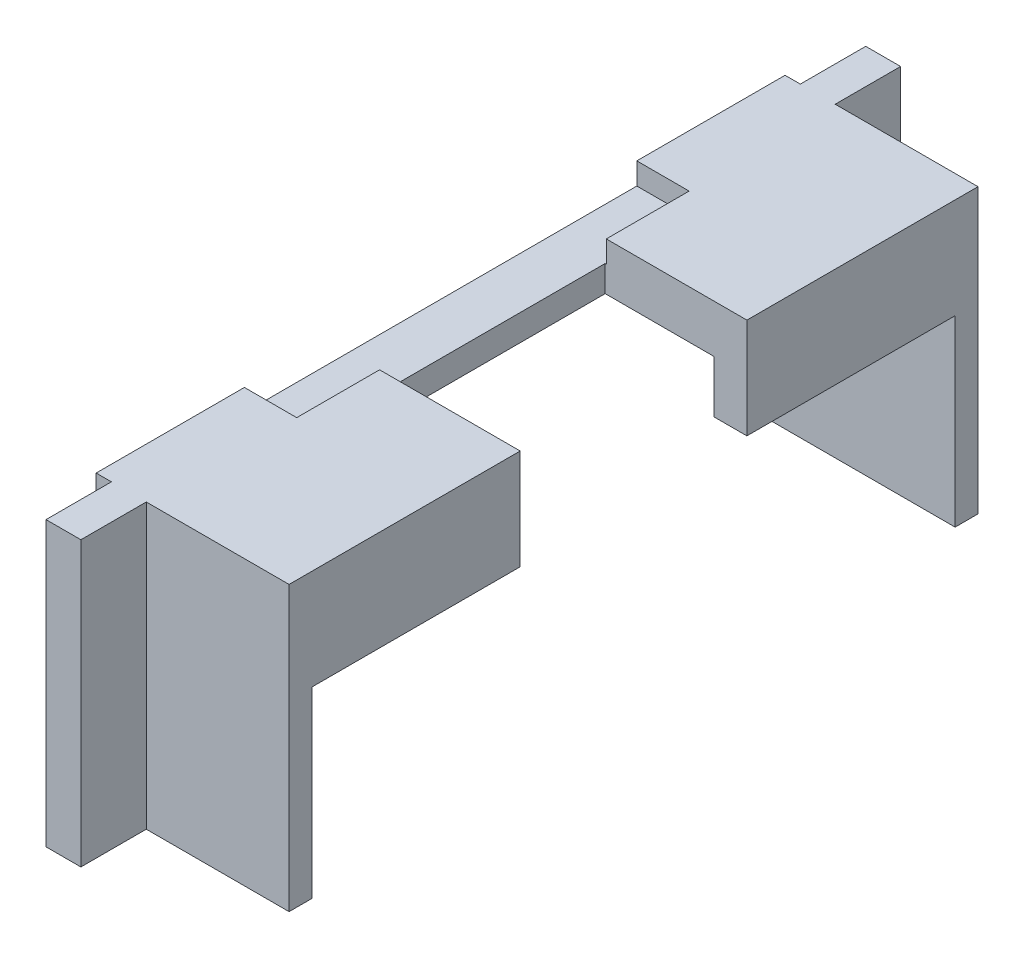
ISO-10303-21;
HEADER;
FILE_DESCRIPTION(('STEP AP214'),'2;1');
FILE_NAME('part.step','',(''),(''),'','','');
FILE_SCHEMA(('AUTOMOTIVE_DESIGN { 1 0 10303 214 1 1 1 1 }'));
ENDSEC;
DATA;
#1=APPLICATION_CONTEXT('core data for automotive mechanical design processes');
#2=APPLICATION_PROTOCOL_DEFINITION('international standard','automotive_design',2000,#1);
#3=PRODUCT_CONTEXT('',#1,'mechanical');
#4=PRODUCT('Part','Part','',(#3));
#5=PRODUCT_RELATED_PRODUCT_CATEGORY('part','',(#4));
#6=PRODUCT_DEFINITION_FORMATION('','',#4);
#7=PRODUCT_DEFINITION_CONTEXT('part definition',#1,'design');
#8=PRODUCT_DEFINITION('design','',#6,#7);
#9=PRODUCT_DEFINITION_SHAPE('','',#8);
#10=(LENGTH_UNIT() NAMED_UNIT(*) SI_UNIT(.MILLI.,.METRE.));
#11=(NAMED_UNIT(*) PLANE_ANGLE_UNIT() SI_UNIT($,.RADIAN.));
#12=(NAMED_UNIT(*) SI_UNIT($,.STERADIAN.) SOLID_ANGLE_UNIT());
#13=UNCERTAINTY_MEASURE_WITH_UNIT(LENGTH_MEASURE(1.E-05),#10,'distance_accuracy_value','');
#14=(GEOMETRIC_REPRESENTATION_CONTEXT(3) GLOBAL_UNCERTAINTY_ASSIGNED_CONTEXT((#13)) GLOBAL_UNIT_ASSIGNED_CONTEXT((#10,
#11,#12)) REPRESENTATION_CONTEXT('',''));
#15=CARTESIAN_POINT('',(0.,0.,0.));
#16=DIRECTION('',(0.,0.,1.));
#17=DIRECTION('',(1.,0.,0.));
#18=AXIS2_PLACEMENT_3D('',#15,#16,#17);
#19=CARTESIAN_POINT('',(3.,13.,19.));
#20=DIRECTION('',(0.,-1.,0.));
#21=DIRECTION('',(0.,0.,-1.));
#22=AXIS2_PLACEMENT_3D('',#19,#20,#21);
#23=PLANE('',#22);
#24=DIRECTION('',(0.,0.,1.));
#25=VECTOR('',#24,1.);
#26=CARTESIAN_POINT('',(0.,13.,19.));
#27=LINE('',#26,#25);
#28=CARTESIAN_POINT('',(0.,13.,-15.8));
#29=VERTEX_POINT('',#28);
#30=CARTESIAN_POINT('',(0.,13.,-8.99999999999999));
#31=VERTEX_POINT('',#30);
#32=EDGE_CURVE('E456',#29,#31,#27,.T.);
#33=ORIENTED_EDGE('',*,*,#32,.T.);
#34=DIRECTION('',(-1.,0.,0.));
#35=VECTOR('',#34,1.);
#36=CARTESIAN_POINT('',(2.4,13.,-8.99999999999999));
#37=LINE('',#36,#35);
#38=CARTESIAN_POINT('',(2.4,13.,-8.99999999999999));
#39=VERTEX_POINT('',#38);
#40=EDGE_CURVE('E265',#39,#31,#37,.T.);
#41=ORIENTED_EDGE('',*,*,#40,.F.);
#42=DIRECTION('',(0.,0.,-1.));
#43=VECTOR('',#42,1.);
#44=CARTESIAN_POINT('',(2.4,13.,-8.99999999999999));
#45=LINE('',#44,#43);
#46=CARTESIAN_POINT('',(2.4,13.,-5.2));
#47=VERTEX_POINT('',#46);
#48=EDGE_CURVE('E254',#47,#39,#45,.T.);
#49=ORIENTED_EDGE('',*,*,#48,.F.);
#50=DIRECTION('',(-1.,0.,0.));
#51=VECTOR('',#50,1.);
#52=CARTESIAN_POINT('',(8.85,13.,-5.2));
#53=LINE('',#52,#51);
#54=CARTESIAN_POINT('',(8.85,13.,-5.2));
#55=VERTEX_POINT('',#54);
#56=EDGE_CURVE('E282',#55,#47,#53,.T.);
#57=ORIENTED_EDGE('',*,*,#56,.F.);
#58=DIRECTION('',(0.,0.,1.));
#59=VECTOR('',#58,1.);
#60=CARTESIAN_POINT('',(8.85,13.,-15.8));
#61=LINE('',#60,#59);
#62=CARTESIAN_POINT('',(8.85,13.,-15.8));
#63=VERTEX_POINT('',#62);
#64=EDGE_CURVE('E332',#63,#55,#61,.T.);
#65=ORIENTED_EDGE('',*,*,#64,.F.);
#66=DIRECTION('',(1.,0.,0.));
#67=VECTOR('',#66,1.);
#68=CARTESIAN_POINT('',(2.3,13.,-15.8));
#69=LINE('',#68,#67);
#70=CARTESIAN_POINT('',(2.3,13.,-15.8));
#71=VERTEX_POINT('',#70);
#72=EDGE_CURVE('E437',#71,#63,#69,.T.);
#73=ORIENTED_EDGE('',*,*,#72,.F.);
#74=DIRECTION('',(0.,0.,1.));
#75=VECTOR('',#74,1.);
#76=CARTESIAN_POINT('',(2.3,13.,-18.8));
#77=LINE('',#76,#75);
#78=CARTESIAN_POINT('',(2.3,13.,-18.8));
#79=VERTEX_POINT('',#78);
#80=EDGE_CURVE('E434',#79,#71,#77,.T.);
#81=ORIENTED_EDGE('',*,*,#80,.F.);
#82=DIRECTION('',(1.,0.,0.));
#83=VECTOR('',#82,1.);
#84=CARTESIAN_POINT('',(0.7,13.,-18.8));
#85=LINE('',#84,#83);
#86=CARTESIAN_POINT('',(0.7,13.,-18.8));
#87=VERTEX_POINT('',#86);
#88=EDGE_CURVE('E364',#87,#79,#85,.T.);
#89=ORIENTED_EDGE('',*,*,#88,.F.);
#90=DIRECTION('',(0.,0.,-1.));
#91=VECTOR('',#90,1.);
#92=CARTESIAN_POINT('',(0.7,13.,-18.8));
#93=LINE('',#92,#91);
#94=CARTESIAN_POINT('',(0.7,13.,-15.8));
#95=VERTEX_POINT('',#94);
#96=EDGE_CURVE('E420',#95,#87,#93,.T.);
#97=ORIENTED_EDGE('',*,*,#96,.F.);
#98=DIRECTION('',(1.,0.,0.));
#99=VECTOR('',#98,1.);
#100=CARTESIAN_POINT('',(0.7,13.,-15.8));
#101=LINE('',#100,#99);
#102=EDGE_CURVE('E439',#29,#95,#101,.T.);
#103=ORIENTED_EDGE('',*,*,#102,.F.);
#104=EDGE_LOOP('',(#33,#41,#49,#57,#65,#73,#81,#89,#97,#103));
#105=FACE_BOUND('',#104,.T.);
#106=ADVANCED_FACE('F36',(#105),#23,.F.);
#107=CARTESIAN_POINT('',(8.85,0.,0.));
#108=DIRECTION('',(1.,0.,0.));
#109=DIRECTION('',(0.,0.,-1.));
#110=AXIS2_PLACEMENT_3D('',#107,#108,#109);
#111=PLANE('',#110);
#112=DIRECTION('',(0.,1.,0.));
#113=VECTOR('',#112,1.);
#114=CARTESIAN_POINT('',(8.85,3.,5.2));
#115=LINE('',#114,#113);
#116=CARTESIAN_POINT('',(8.85,8.4,5.2));
#117=VERTEX_POINT('',#116);
#118=CARTESIAN_POINT('',(8.85,13.,5.2));
#119=VERTEX_POINT('',#118);
#120=EDGE_CURVE('E285',#117,#119,#115,.T.);
#121=ORIENTED_EDGE('',*,*,#120,.T.);
#122=CARTESIAN_POINT('',(8.85,13.,15.8));
#123=VERTEX_POINT('',#122);
#124=EDGE_CURVE('E331',#119,#123,#61,.T.);
#125=ORIENTED_EDGE('',*,*,#124,.T.);
#126=DIRECTION('',(0.,-1.,0.));
#127=VECTOR('',#126,1.);
#128=CARTESIAN_POINT('',(8.85,13.,15.8));
#129=LINE('',#128,#127);
#130=CARTESIAN_POINT('',(8.85,0.,15.8));
#131=VERTEX_POINT('',#130);
#132=EDGE_CURVE('E335',#123,#131,#129,.T.);
#133=ORIENTED_EDGE('',*,*,#132,.T.);
#134=DIRECTION('',(0.,0.,-1.));
#135=VECTOR('',#134,1.);
#136=CARTESIAN_POINT('',(8.85,0.,15.8));
#137=LINE('',#136,#135);
#138=CARTESIAN_POINT('',(8.85,0.,14.75));
#139=VERTEX_POINT('',#138);
#140=EDGE_CURVE('E338',#131,#139,#137,.T.);
#141=ORIENTED_EDGE('',*,*,#140,.T.);
#142=DIRECTION('',(0.,1.,0.));
#143=VECTOR('',#142,1.);
#144=CARTESIAN_POINT('',(8.85,0.,14.75));
#145=LINE('',#144,#143);
#146=CARTESIAN_POINT('',(8.85,8.4,14.75));
#147=VERTEX_POINT('',#146);
#148=EDGE_CURVE('E341',#139,#147,#145,.T.);
#149=ORIENTED_EDGE('',*,*,#148,.T.);
#150=DIRECTION('',(0.,0.,-1.));
#151=VECTOR('',#150,1.);
#152=CARTESIAN_POINT('',(8.85,8.4,5.00000000000003));
#153=LINE('',#152,#151);
#154=EDGE_CURVE('E317',#147,#117,#153,.T.);
#155=ORIENTED_EDGE('',*,*,#154,.T.);
#156=EDGE_LOOP('',(#121,#125,#133,#141,#149,#155));
#157=FACE_BOUND('',#156,.T.);
#158=ADVANCED_FACE('F494',(#157),#111,.T.);
#159=CARTESIAN_POINT('',(3.,0.,-19.));
#160=DIRECTION('',(0.,1.,0.));
#161=DIRECTION('',(0.,0.,1.));
#162=AXIS2_PLACEMENT_3D('',#159,#160,#161);
#163=PLANE('',#162);
#164=DIRECTION('',(0.,0.,-1.));
#165=VECTOR('',#164,1.);
#166=CARTESIAN_POINT('',(0.,0.,-19.));
#167=LINE('',#166,#165);
#168=CARTESIAN_POINT('',(0.,0.,15.8));
#169=VERTEX_POINT('',#168);
#170=CARTESIAN_POINT('',(0.,0.,14.75));
#171=VERTEX_POINT('',#170);
#172=EDGE_CURVE('E452',#169,#171,#167,.T.);
#173=ORIENTED_EDGE('',*,*,#172,.T.);
#174=DIRECTION('',(1.,0.,0.));
#175=VECTOR('',#174,1.);
#176=CARTESIAN_POINT('',(0.,0.,14.75));
#177=LINE('',#176,#175);
#178=EDGE_CURVE('E362',#171,#139,#177,.T.);
#179=ORIENTED_EDGE('',*,*,#178,.T.);
#180=ORIENTED_EDGE('',*,*,#140,.F.);
#181=DIRECTION('',(-1.,0.,0.));
#182=VECTOR('',#181,1.);
#183=CARTESIAN_POINT('',(2.3,0.,15.8));
#184=LINE('',#183,#182);
#185=CARTESIAN_POINT('',(2.3,0.,15.8));
#186=VERTEX_POINT('',#185);
#187=EDGE_CURVE('E373',#131,#186,#184,.T.);
#188=ORIENTED_EDGE('',*,*,#187,.T.);
#189=DIRECTION('',(0.,0.,1.));
#190=VECTOR('',#189,1.);
#191=CARTESIAN_POINT('',(2.3,0.,18.8));
#192=LINE('',#191,#190);
#193=CARTESIAN_POINT('',(2.3,0.,18.8));
#194=VERTEX_POINT('',#193);
#195=EDGE_CURVE('E376',#186,#194,#192,.T.);
#196=ORIENTED_EDGE('',*,*,#195,.T.);
#197=DIRECTION('',(-1.,0.,0.));
#198=VECTOR('',#197,1.);
#199=CARTESIAN_POINT('',(0.7,0.,18.8));
#200=LINE('',#199,#198);
#201=CARTESIAN_POINT('',(0.7,0.,18.8));
#202=VERTEX_POINT('',#201);
#203=EDGE_CURVE('E380',#194,#202,#200,.T.);
#204=ORIENTED_EDGE('',*,*,#203,.T.);
#205=DIRECTION('',(0.,0.,-1.));
#206=VECTOR('',#205,1.);
#207=CARTESIAN_POINT('',(0.7,0.,18.8));
#208=LINE('',#207,#206);
#209=CARTESIAN_POINT('',(0.7,0.,15.8));
#210=VERTEX_POINT('',#209);
#211=EDGE_CURVE('E383',#202,#210,#208,.T.);
#212=ORIENTED_EDGE('',*,*,#211,.T.);
#213=DIRECTION('',(-1.,0.,0.));
#214=VECTOR('',#213,1.);
#215=CARTESIAN_POINT('',(0.7,0.,15.8));
#216=LINE('',#215,#214);
#217=EDGE_CURVE('E386',#210,#169,#216,.T.);
#218=ORIENTED_EDGE('',*,*,#217,.T.);
#219=EDGE_LOOP('',(#173,#179,#180,#188,#196,#204,#212,#218));
#220=FACE_BOUND('',#219,.T.);
#221=ADVANCED_FACE('F528',(#220),#163,.F.);
#222=DIRECTION('',(1.,0.,0.));
#223=VECTOR('',#222,1.);
#224=CARTESIAN_POINT('',(2.3,0.,-15.8));
#225=LINE('',#224,#223);
#226=CARTESIAN_POINT('',(2.3,0.,-15.8));
#227=VERTEX_POINT('',#226);
#228=CARTESIAN_POINT('',(8.85,0.,-15.8));
#229=VERTEX_POINT('',#228);
#230=EDGE_CURVE('E423',#227,#229,#225,.T.);
#231=ORIENTED_EDGE('',*,*,#230,.T.);
#232=DIRECTION('',(0.,0.,-1.));
#233=VECTOR('',#232,1.);
#234=CARTESIAN_POINT('',(8.85,0.,-14.75));
#235=LINE('',#234,#233);
#236=CARTESIAN_POINT('',(8.85,0.,-14.75));
#237=VERTEX_POINT('',#236);
#238=EDGE_CURVE('E346',#237,#229,#235,.T.);
#239=ORIENTED_EDGE('',*,*,#238,.F.);
#240=DIRECTION('',(1.,0.,0.));
#241=VECTOR('',#240,1.);
#242=CARTESIAN_POINT('',(0.,0.,-14.75));
#243=LINE('',#242,#241);
#244=CARTESIAN_POINT('',(0.,0.,-14.75));
#245=VERTEX_POINT('',#244);
#246=EDGE_CURVE('E361',#245,#237,#243,.T.);
#247=ORIENTED_EDGE('',*,*,#246,.F.);
#248=CARTESIAN_POINT('',(0.,0.,-15.8));
#249=VERTEX_POINT('',#248);
#250=EDGE_CURVE('E408',#245,#249,#167,.T.);
#251=ORIENTED_EDGE('',*,*,#250,.T.);
#252=DIRECTION('',(1.,0.,0.));
#253=VECTOR('',#252,1.);
#254=CARTESIAN_POINT('',(0.7,0.,-15.8));
#255=LINE('',#254,#253);
#256=CARTESIAN_POINT('',(0.7,0.,-15.8));
#257=VERTEX_POINT('',#256);
#258=EDGE_CURVE('E425',#249,#257,#255,.T.);
#259=ORIENTED_EDGE('',*,*,#258,.T.);
#260=DIRECTION('',(0.,0.,-1.));
#261=VECTOR('',#260,1.);
#262=CARTESIAN_POINT('',(0.7,0.,-18.8));
#263=LINE('',#262,#261);
#264=CARTESIAN_POINT('',(0.7,0.,-18.8));
#265=VERTEX_POINT('',#264);
#266=EDGE_CURVE('E428',#257,#265,#263,.T.);
#267=ORIENTED_EDGE('',*,*,#266,.T.);
#268=DIRECTION('',(1.,0.,0.));
#269=VECTOR('',#268,1.);
#270=CARTESIAN_POINT('',(0.7,0.,-18.8));
#271=LINE('',#270,#269);
#272=CARTESIAN_POINT('',(2.3,0.,-18.8));
#273=VERTEX_POINT('',#272);
#274=EDGE_CURVE('E416',#265,#273,#271,.T.);
#275=ORIENTED_EDGE('',*,*,#274,.T.);
#276=DIRECTION('',(0.,0.,1.));
#277=VECTOR('',#276,1.);
#278=CARTESIAN_POINT('',(2.3,0.,-18.8));
#279=LINE('',#278,#277);
#280=EDGE_CURVE('E419',#273,#227,#279,.T.);
#281=ORIENTED_EDGE('',*,*,#280,.T.);
#282=EDGE_LOOP('',(#231,#239,#247,#251,#259,#267,#275,#281));
#283=FACE_BOUND('',#282,.T.);
#284=ADVANCED_FACE('F38',(#283),#163,.F.);
#285=CARTESIAN_POINT('',(2.4,13.,9.));
#286=VERTEX_POINT('',#285);
#287=CARTESIAN_POINT('',(2.4,13.,5.2));
#288=VERTEX_POINT('',#287);
#289=EDGE_CURVE('E245',#286,#288,#45,.T.);
#290=ORIENTED_EDGE('',*,*,#289,.F.);
#291=DIRECTION('',(-1.,0.,0.));
#292=VECTOR('',#291,1.);
#293=CARTESIAN_POINT('',(2.4,13.,9.));
#294=LINE('',#293,#292);
#295=CARTESIAN_POINT('',(0.,13.,9.));
#296=VERTEX_POINT('',#295);
#297=EDGE_CURVE('E268',#286,#296,#294,.T.);
#298=ORIENTED_EDGE('',*,*,#297,.T.);
#299=CARTESIAN_POINT('',(0.,13.,15.8));
#300=VERTEX_POINT('',#299);
#301=EDGE_CURVE('E455',#296,#300,#27,.T.);
#302=ORIENTED_EDGE('',*,*,#301,.T.);
#303=DIRECTION('',(-1.,0.,0.));
#304=VECTOR('',#303,1.);
#305=CARTESIAN_POINT('',(0.7,13.,15.8));
#306=LINE('',#305,#304);
#307=CARTESIAN_POINT('',(0.7,13.,15.8));
#308=VERTEX_POINT('',#307);
#309=EDGE_CURVE('E377',#308,#300,#306,.T.);
#310=ORIENTED_EDGE('',*,*,#309,.F.);
#311=DIRECTION('',(0.,0.,-1.));
#312=VECTOR('',#311,1.);
#313=CARTESIAN_POINT('',(0.7,13.,18.8));
#314=LINE('',#313,#312);
#315=CARTESIAN_POINT('',(0.7,13.,18.8));
#316=VERTEX_POINT('',#315);
#317=EDGE_CURVE('E400',#316,#308,#314,.T.);
#318=ORIENTED_EDGE('',*,*,#317,.F.);
#319=DIRECTION('',(-1.,0.,0.));
#320=VECTOR('',#319,1.);
#321=CARTESIAN_POINT('',(0.7,13.,18.8));
#322=LINE('',#321,#320);
#323=CARTESIAN_POINT('',(2.3,13.,18.8));
#324=VERTEX_POINT('',#323);
#325=EDGE_CURVE('E397',#324,#316,#322,.T.);
#326=ORIENTED_EDGE('',*,*,#325,.F.);
#327=DIRECTION('',(0.,0.,1.));
#328=VECTOR('',#327,1.);
#329=CARTESIAN_POINT('',(2.3,13.,18.8));
#330=LINE('',#329,#328);
#331=CARTESIAN_POINT('',(2.3,13.,15.8));
#332=VERTEX_POINT('',#331);
#333=EDGE_CURVE('E393',#332,#324,#330,.T.);
#334=ORIENTED_EDGE('',*,*,#333,.F.);
#335=DIRECTION('',(-1.,0.,0.));
#336=VECTOR('',#335,1.);
#337=CARTESIAN_POINT('',(2.3,13.,15.8));
#338=LINE('',#337,#336);
#339=EDGE_CURVE('E390',#123,#332,#338,.T.);
#340=ORIENTED_EDGE('',*,*,#339,.F.);
#341=ORIENTED_EDGE('',*,*,#124,.F.);
#342=DIRECTION('',(1.,0.,0.));
#343=VECTOR('',#342,1.);
#344=CARTESIAN_POINT('',(2.35,13.,5.2));
#345=LINE('',#344,#343);
#346=EDGE_CURVE('E280',#288,#119,#345,.T.);
#347=ORIENTED_EDGE('',*,*,#346,.F.);
#348=EDGE_LOOP('',(#290,#298,#302,#310,#318,#326,#334,#340,#341,#347));
#349=FACE_BOUND('',#348,.T.);
#350=ADVANCED_FACE('F487',(#349),#23,.F.);
#351=CARTESIAN_POINT('',(0.,0.,0.));
#352=DIRECTION('',(-1.,0.,0.));
#353=DIRECTION('',(0.,0.,1.));
#354=AXIS2_PLACEMENT_3D('',#351,#352,#353);
#355=PLANE('',#354);
#356=DIRECTION('',(0.,-1.,0.));
#357=VECTOR('',#356,1.);
#358=CARTESIAN_POINT('',(0.,13.,-8.99999999999999));
#359=LINE('',#358,#357);
#360=CARTESIAN_POINT('',(0.,12.,-8.99999999999999));
#361=VERTEX_POINT('',#360);
#362=EDGE_CURVE('E240',#31,#361,#359,.T.);
#363=ORIENTED_EDGE('',*,*,#362,.F.);
#364=ORIENTED_EDGE('',*,*,#32,.F.);
#365=DIRECTION('',(0.,1.,0.));
#366=VECTOR('',#365,1.);
#367=CARTESIAN_POINT('',(0.,0.,-15.8));
#368=LINE('',#367,#366);
#369=EDGE_CURVE('E447',#249,#29,#368,.T.);
#370=ORIENTED_EDGE('',*,*,#369,.F.);
#371=ORIENTED_EDGE('',*,*,#250,.F.);
#372=DIRECTION('',(0.,1.,0.));
#373=VECTOR('',#372,1.);
#374=CARTESIAN_POINT('',(0.,0.,-14.75));
#375=LINE('',#374,#373);
#376=CARTESIAN_POINT('',(0.,10.8,-14.75));
#377=VERTEX_POINT('',#376);
#378=EDGE_CURVE('E352',#245,#377,#375,.T.);
#379=ORIENTED_EDGE('',*,*,#378,.T.);
#380=DIRECTION('',(0.,0.,1.));
#381=VECTOR('',#380,1.);
#382=CARTESIAN_POINT('',(0.,10.8,14.75));
#383=LINE('',#382,#381);
#384=CARTESIAN_POINT('',(0.,10.8,14.75));
#385=VERTEX_POINT('',#384);
#386=EDGE_CURVE('E355',#377,#385,#383,.T.);
#387=ORIENTED_EDGE('',*,*,#386,.T.);
#388=DIRECTION('',(0.,-1.,0.));
#389=VECTOR('',#388,1.);
#390=CARTESIAN_POINT('',(0.,0.,14.75));
#391=LINE('',#390,#389);
#392=EDGE_CURVE('E358',#385,#171,#391,.T.);
#393=ORIENTED_EDGE('',*,*,#392,.T.);
#394=ORIENTED_EDGE('',*,*,#172,.F.);
#395=DIRECTION('',(0.,1.,0.));
#396=VECTOR('',#395,1.);
#397=CARTESIAN_POINT('',(0.,0.,15.8));
#398=LINE('',#397,#396);
#399=EDGE_CURVE('E405',#169,#300,#398,.T.);
#400=ORIENTED_EDGE('',*,*,#399,.T.);
#401=ORIENTED_EDGE('',*,*,#301,.F.);
#402=DIRECTION('',(0.,1.,0.));
#403=VECTOR('',#402,1.);
#404=CARTESIAN_POINT('',(0.,13.,9.));
#405=LINE('',#404,#403);
#406=CARTESIAN_POINT('',(0.,12.,9.));
#407=VERTEX_POINT('',#406);
#408=EDGE_CURVE('E255',#407,#296,#405,.T.);
#409=ORIENTED_EDGE('',*,*,#408,.F.);
#410=DIRECTION('',(0.,0.,1.));
#411=VECTOR('',#410,1.);
#412=CARTESIAN_POINT('',(0.,12.,9.));
#413=LINE('',#412,#411);
#414=EDGE_CURVE('E257',#361,#407,#413,.T.);
#415=ORIENTED_EDGE('',*,*,#414,.F.);
#416=EDGE_LOOP('',(#363,#364,#370,#371,#379,#387,#393,#394,#400,#401,#409,#415));
#417=FACE_BOUND('',#416,.T.);
#418=ADVANCED_FACE('F473',(#417),#355,.T.);
#419=CARTESIAN_POINT('',(0.7,0.,-18.8));
#420=DIRECTION('',(0.,0.,1.));
#421=DIRECTION('',(1.,0.,0.));
#422=AXIS2_PLACEMENT_3D('',#419,#420,#421);
#423=PLANE('',#422);
#424=ORIENTED_EDGE('',*,*,#88,.T.);
#425=DIRECTION('',(0.,1.,0.));
#426=VECTOR('',#425,1.);
#427=CARTESIAN_POINT('',(2.3,0.,-18.8));
#428=LINE('',#427,#426);
#429=EDGE_CURVE('E431',#273,#79,#428,.T.);
#430=ORIENTED_EDGE('',*,*,#429,.F.);
#431=ORIENTED_EDGE('',*,*,#274,.F.);
#432=DIRECTION('',(0.,1.,0.));
#433=VECTOR('',#432,1.);
#434=CARTESIAN_POINT('',(0.7,0.,-18.8));
#435=LINE('',#434,#433);
#436=EDGE_CURVE('E394',#265,#87,#435,.T.);
#437=ORIENTED_EDGE('',*,*,#436,.T.);
#438=EDGE_LOOP('',(#424,#430,#431,#437));
#439=FACE_BOUND('',#438,.T.);
#440=ADVANCED_FACE('F537',(#439),#423,.F.);
#441=CARTESIAN_POINT('',(0.7,0.,-18.8));
#442=DIRECTION('',(1.,0.,0.));
#443=DIRECTION('',(0.,0.,-1.));
#444=AXIS2_PLACEMENT_3D('',#441,#442,#443);
#445=PLANE('',#444);
#446=ORIENTED_EDGE('',*,*,#96,.T.);
#447=ORIENTED_EDGE('',*,*,#436,.F.);
#448=ORIENTED_EDGE('',*,*,#266,.F.);
#449=DIRECTION('',(0.,1.,0.));
#450=VECTOR('',#449,1.);
#451=CARTESIAN_POINT('',(0.7,0.,-15.8));
#452=LINE('',#451,#450);
#453=EDGE_CURVE('E445',#257,#95,#452,.T.);
#454=ORIENTED_EDGE('',*,*,#453,.T.);
#455=EDGE_LOOP('',(#446,#447,#448,#454));
#456=FACE_BOUND('',#455,.T.);
#457=ADVANCED_FACE('F571',(#456),#445,.F.);
#458=CARTESIAN_POINT('',(0.7,0.,-15.8));
#459=DIRECTION('',(0.,0.,1.));
#460=DIRECTION('',(1.,0.,0.));
#461=AXIS2_PLACEMENT_3D('',#458,#459,#460);
#462=PLANE('',#461);
#463=ORIENTED_EDGE('',*,*,#102,.T.);
#464=ORIENTED_EDGE('',*,*,#453,.F.);
#465=ORIENTED_EDGE('',*,*,#258,.F.);
#466=ORIENTED_EDGE('',*,*,#369,.T.);
#467=EDGE_LOOP('',(#463,#464,#465,#466));
#468=FACE_BOUND('',#467,.T.);
#469=ADVANCED_FACE('F568',(#468),#462,.F.);
#470=CARTESIAN_POINT('',(2.3,0.,-15.8));
#471=DIRECTION('',(0.,0.,1.));
#472=DIRECTION('',(1.,0.,0.));
#473=AXIS2_PLACEMENT_3D('',#470,#471,#472);
#474=PLANE('',#473);
#475=ORIENTED_EDGE('',*,*,#72,.T.);
#476=DIRECTION('',(0.,1.,0.));
#477=VECTOR('',#476,1.);
#478=CARTESIAN_POINT('',(8.85,0.,-15.8));
#479=LINE('',#478,#477);
#480=EDGE_CURVE('E349',#229,#63,#479,.T.);
#481=ORIENTED_EDGE('',*,*,#480,.F.);
#482=ORIENTED_EDGE('',*,*,#230,.F.);
#483=DIRECTION('',(0.,1.,0.));
#484=VECTOR('',#483,1.);
#485=CARTESIAN_POINT('',(2.3,0.,-15.8));
#486=LINE('',#485,#484);
#487=EDGE_CURVE('E449',#227,#71,#486,.T.);
#488=ORIENTED_EDGE('',*,*,#487,.T.);
#489=EDGE_LOOP('',(#475,#481,#482,#488));
#490=FACE_BOUND('',#489,.T.);
#491=ADVANCED_FACE('F552',(#490),#474,.F.);
#492=CARTESIAN_POINT('',(2.3,0.,-18.8));
#493=DIRECTION('',(-1.,0.,0.));
#494=DIRECTION('',(0.,0.,1.));
#495=AXIS2_PLACEMENT_3D('',#492,#493,#494);
#496=PLANE('',#495);
#497=ORIENTED_EDGE('',*,*,#80,.T.);
#498=ORIENTED_EDGE('',*,*,#487,.F.);
#499=ORIENTED_EDGE('',*,*,#280,.F.);
#500=ORIENTED_EDGE('',*,*,#429,.T.);
#501=EDGE_LOOP('',(#497,#498,#499,#500));
#502=FACE_BOUND('',#501,.T.);
#503=ADVANCED_FACE('F576',(#502),#496,.F.);
#504=CARTESIAN_POINT('',(0.7,0.,15.8));
#505=DIRECTION('',(0.,0.,-1.));
#506=DIRECTION('',(-1.,0.,0.));
#507=AXIS2_PLACEMENT_3D('',#504,#505,#506);
#508=PLANE('',#507);
#509=ORIENTED_EDGE('',*,*,#309,.T.);
#510=ORIENTED_EDGE('',*,*,#399,.F.);
#511=ORIENTED_EDGE('',*,*,#217,.F.);
#512=DIRECTION('',(0.,1.,0.));
#513=VECTOR('',#512,1.);
#514=CARTESIAN_POINT('',(0.7,0.,15.8));
#515=LINE('',#514,#513);
#516=EDGE_CURVE('E409',#210,#308,#515,.T.);
#517=ORIENTED_EDGE('',*,*,#516,.T.);
#518=EDGE_LOOP('',(#509,#510,#511,#517));
#519=FACE_BOUND('',#518,.T.);
#520=ADVANCED_FACE('F578',(#519),#508,.F.);
#521=CARTESIAN_POINT('',(0.7,0.,18.8));
#522=DIRECTION('',(1.,0.,0.));
#523=DIRECTION('',(0.,0.,-1.));
#524=AXIS2_PLACEMENT_3D('',#521,#522,#523);
#525=PLANE('',#524);
#526=ORIENTED_EDGE('',*,*,#317,.T.);
#527=ORIENTED_EDGE('',*,*,#516,.F.);
#528=ORIENTED_EDGE('',*,*,#211,.F.);
#529=DIRECTION('',(0.,1.,0.));
#530=VECTOR('',#529,1.);
#531=CARTESIAN_POINT('',(0.7,0.,18.8));
#532=LINE('',#531,#530);
#533=EDGE_CURVE('E411',#202,#316,#532,.T.);
#534=ORIENTED_EDGE('',*,*,#533,.T.);
#535=EDGE_LOOP('',(#526,#527,#528,#534));
#536=FACE_BOUND('',#535,.T.);
#537=ADVANCED_FACE('F584',(#536),#525,.F.);
#538=CARTESIAN_POINT('',(0.7,0.,18.8));
#539=DIRECTION('',(0.,0.,-1.));
#540=DIRECTION('',(-1.,0.,0.));
#541=AXIS2_PLACEMENT_3D('',#538,#539,#540);
#542=PLANE('',#541);
#543=ORIENTED_EDGE('',*,*,#325,.T.);
#544=ORIENTED_EDGE('',*,*,#533,.F.);
#545=ORIENTED_EDGE('',*,*,#203,.F.);
#546=DIRECTION('',(0.,1.,0.));
#547=VECTOR('',#546,1.);
#548=CARTESIAN_POINT('',(2.3,0.,18.8));
#549=LINE('',#548,#547);
#550=EDGE_CURVE('E413',#194,#324,#549,.T.);
#551=ORIENTED_EDGE('',*,*,#550,.T.);
#552=EDGE_LOOP('',(#543,#544,#545,#551));
#553=FACE_BOUND('',#552,.T.);
#554=ADVANCED_FACE('F606',(#553),#542,.F.);
#555=CARTESIAN_POINT('',(2.3,0.,18.8));
#556=DIRECTION('',(-1.,0.,0.));
#557=DIRECTION('',(0.,0.,1.));
#558=AXIS2_PLACEMENT_3D('',#555,#556,#557);
#559=PLANE('',#558);
#560=ORIENTED_EDGE('',*,*,#333,.T.);
#561=ORIENTED_EDGE('',*,*,#550,.F.);
#562=ORIENTED_EDGE('',*,*,#195,.F.);
#563=DIRECTION('',(0.,1.,0.));
#564=VECTOR('',#563,1.);
#565=CARTESIAN_POINT('',(2.3,0.,15.8));
#566=LINE('',#565,#564);
#567=EDGE_CURVE('E389',#186,#332,#566,.T.);
#568=ORIENTED_EDGE('',*,*,#567,.T.);
#569=EDGE_LOOP('',(#560,#561,#562,#568));
#570=FACE_BOUND('',#569,.T.);
#571=ADVANCED_FACE('F602',(#570),#559,.F.);
#572=CARTESIAN_POINT('',(2.3,0.,15.8));
#573=DIRECTION('',(0.,0.,-1.));
#574=DIRECTION('',(-1.,0.,0.));
#575=AXIS2_PLACEMENT_3D('',#572,#573,#574);
#576=PLANE('',#575);
#577=ORIENTED_EDGE('',*,*,#339,.T.);
#578=ORIENTED_EDGE('',*,*,#567,.F.);
#579=ORIENTED_EDGE('',*,*,#187,.F.);
#580=ORIENTED_EDGE('',*,*,#132,.F.);
#581=EDGE_LOOP('',(#577,#578,#579,#580));
#582=FACE_BOUND('',#581,.T.);
#583=ADVANCED_FACE('F599',(#582),#576,.F.);
#584=CARTESIAN_POINT('',(0.,0.,14.75));
#585=DIRECTION('',(0.,0.,1.));
#586=DIRECTION('',(1.,0.,0.));
#587=AXIS2_PLACEMENT_3D('',#584,#585,#586);
#588=PLANE('',#587);
#589=DIRECTION('',(0.,-1.,0.));
#590=VECTOR('',#589,1.);
#591=CARTESIAN_POINT('',(7.35,8.4,14.75));
#592=LINE('',#591,#590);
#593=CARTESIAN_POINT('',(7.35,10.8,14.75));
#594=VERTEX_POINT('',#593);
#595=CARTESIAN_POINT('',(7.35,8.4,14.75));
#596=VERTEX_POINT('',#595);
#597=EDGE_CURVE('E318',#594,#596,#592,.T.);
#598=ORIENTED_EDGE('',*,*,#597,.T.);
#599=DIRECTION('',(1.,0.,0.));
#600=VECTOR('',#599,1.);
#601=CARTESIAN_POINT('',(7.35,8.4,14.75));
#602=LINE('',#601,#600);
#603=EDGE_CURVE('E326',#596,#147,#602,.T.);
#604=ORIENTED_EDGE('',*,*,#603,.T.);
#605=ORIENTED_EDGE('',*,*,#148,.F.);
#606=ORIENTED_EDGE('',*,*,#178,.F.);
#607=ORIENTED_EDGE('',*,*,#392,.F.);
#608=DIRECTION('',(1.,0.,0.));
#609=VECTOR('',#608,1.);
#610=CARTESIAN_POINT('',(0.,10.8,14.75));
#611=LINE('',#610,#609);
#612=EDGE_CURVE('E365',#385,#594,#611,.T.);
#613=ORIENTED_EDGE('',*,*,#612,.T.);
#614=EDGE_LOOP('',(#598,#604,#605,#606,#607,#613));
#615=FACE_BOUND('',#614,.T.);
#616=ADVANCED_FACE('F500',(#615),#588,.F.);
#617=CARTESIAN_POINT('',(0.,10.8,14.75));
#618=DIRECTION('',(0.,1.,0.));
#619=DIRECTION('',(0.,0.,1.));
#620=AXIS2_PLACEMENT_3D('',#617,#618,#619);
#621=PLANE('',#620);
#622=DIRECTION('',(0.,0.,1.));
#623=VECTOR('',#622,1.);
#624=CARTESIAN_POINT('',(2.35,10.8,14.75));
#625=LINE('',#624,#623);
#626=CARTESIAN_POINT('',(2.35,10.8,-5.2));
#627=VERTEX_POINT('',#626);
#628=CARTESIAN_POINT('',(2.35,10.8,5.2));
#629=VERTEX_POINT('',#628);
#630=EDGE_CURVE('E464',#627,#629,#625,.T.);
#631=ORIENTED_EDGE('',*,*,#630,.T.);
#632=DIRECTION('',(1.,0.,0.));
#633=VECTOR('',#632,1.);
#634=CARTESIAN_POINT('',(0.,10.8,5.2));
#635=LINE('',#634,#633);
#636=CARTESIAN_POINT('',(7.35,10.8,5.2));
#637=VERTEX_POINT('',#636);
#638=EDGE_CURVE('E301',#629,#637,#635,.T.);
#639=ORIENTED_EDGE('',*,*,#638,.T.);
#640=DIRECTION('',(0.,0.,1.));
#641=VECTOR('',#640,1.);
#642=CARTESIAN_POINT('',(7.35,10.8,5.00000000000003));
#643=LINE('',#642,#641);
#644=EDGE_CURVE('E324',#637,#594,#643,.T.);
#645=ORIENTED_EDGE('',*,*,#644,.T.);
#646=ORIENTED_EDGE('',*,*,#612,.F.);
#647=ORIENTED_EDGE('',*,*,#386,.F.);
#648=DIRECTION('',(1.,0.,0.));
#649=VECTOR('',#648,1.);
#650=CARTESIAN_POINT('',(0.,10.8,-14.75));
#651=LINE('',#650,#649);
#652=CARTESIAN_POINT('',(7.35,10.8,-14.75));
#653=VERTEX_POINT('',#652);
#654=EDGE_CURVE('E368',#377,#653,#651,.T.);
#655=ORIENTED_EDGE('',*,*,#654,.T.);
#656=DIRECTION('',(0.,0.,1.));
#657=VECTOR('',#656,1.);
#658=CARTESIAN_POINT('',(7.35,10.8000000000003,-5.));
#659=LINE('',#658,#657);
#660=CARTESIAN_POINT('',(7.35,10.8000000000003,-5.2));
#661=VERTEX_POINT('',#660);
#662=EDGE_CURVE('E310',#653,#661,#659,.T.);
#663=ORIENTED_EDGE('',*,*,#662,.T.);
#664=DIRECTION('',(-1.,0.,0.));
#665=VECTOR('',#664,1.);
#666=CARTESIAN_POINT('',(0.,10.8,-5.2));
#667=LINE('',#666,#665);
#668=EDGE_CURVE('E59',#661,#627,#667,.T.);
#669=ORIENTED_EDGE('',*,*,#668,.T.);
#670=EDGE_LOOP('',(#631,#639,#645,#646,#647,#655,#663,#669));
#671=FACE_BOUND('',#670,.T.);
#672=ADVANCED_FACE('F508',(#671),#621,.F.);
#673=CARTESIAN_POINT('',(0.,0.,-14.75));
#674=DIRECTION('',(0.,0.,-1.));
#675=DIRECTION('',(0.,1.,0.));
#676=AXIS2_PLACEMENT_3D('',#673,#674,#675);
#677=PLANE('',#676);
#678=DIRECTION('',(0.,-1.,0.));
#679=VECTOR('',#678,1.);
#680=CARTESIAN_POINT('',(8.85,10.8,-14.75));
#681=LINE('',#680,#679);
#682=CARTESIAN_POINT('',(8.85,8.4,-14.75));
#683=VERTEX_POINT('',#682);
#684=EDGE_CURVE('E344',#683,#237,#681,.T.);
#685=ORIENTED_EDGE('',*,*,#684,.F.);
#686=DIRECTION('',(1.,0.,0.));
#687=VECTOR('',#686,1.);
#688=CARTESIAN_POINT('',(7.35,8.4,-14.75));
#689=LINE('',#688,#687);
#690=CARTESIAN_POINT('',(7.35,8.4,-14.75));
#691=VERTEX_POINT('',#690);
#692=EDGE_CURVE('E313',#691,#683,#689,.T.);
#693=ORIENTED_EDGE('',*,*,#692,.F.);
#694=DIRECTION('',(0.,1.,0.));
#695=VECTOR('',#694,1.);
#696=CARTESIAN_POINT('',(7.35,8.4,-14.75));
#697=LINE('',#696,#695);
#698=EDGE_CURVE('E307',#691,#653,#697,.T.);
#699=ORIENTED_EDGE('',*,*,#698,.T.);
#700=ORIENTED_EDGE('',*,*,#654,.F.);
#701=ORIENTED_EDGE('',*,*,#378,.F.);
#702=ORIENTED_EDGE('',*,*,#246,.T.);
#703=EDGE_LOOP('',(#685,#693,#699,#700,#701,#702));
#704=FACE_BOUND('',#703,.T.);
#705=ADVANCED_FACE('F563',(#704),#677,.F.);
#706=DIRECTION('',(0.,1.,0.));
#707=VECTOR('',#706,1.);
#708=CARTESIAN_POINT('',(8.85,3.,-5.2));
#709=LINE('',#708,#707);
#710=CARTESIAN_POINT('',(8.85,8.40000000000029,-5.2));
#711=VERTEX_POINT('',#710);
#712=EDGE_CURVE('E293',#711,#55,#709,.T.);
#713=ORIENTED_EDGE('',*,*,#712,.F.);
#714=DIRECTION('',(0.,0.,-1.));
#715=VECTOR('',#714,1.);
#716=CARTESIAN_POINT('',(8.85,8.40000000000029,-5.00000000000014));
#717=LINE('',#716,#715);
#718=EDGE_CURVE('E304',#711,#683,#717,.T.);
#719=ORIENTED_EDGE('',*,*,#718,.T.);
#720=ORIENTED_EDGE('',*,*,#684,.T.);
#721=ORIENTED_EDGE('',*,*,#238,.T.);
#722=ORIENTED_EDGE('',*,*,#480,.T.);
#723=ORIENTED_EDGE('',*,*,#64,.T.);
#724=EDGE_LOOP('',(#713,#719,#720,#721,#722,#723));
#725=FACE_BOUND('',#724,.T.);
#726=ADVANCED_FACE('F530',(#725),#111,.T.);
#727=CARTESIAN_POINT('',(7.35,8.4,5.00000000000003));
#728=DIRECTION('',(0.,-1.,0.));
#729=DIRECTION('',(0.,0.,-1.));
#730=AXIS2_PLACEMENT_3D('',#727,#728,#729);
#731=PLANE('',#730);
#732=DIRECTION('',(-1.,0.,0.));
#733=VECTOR('',#732,1.);
#734=CARTESIAN_POINT('',(7.35,8.4,5.2));
#735=LINE('',#734,#733);
#736=CARTESIAN_POINT('',(7.35,8.4,5.2));
#737=VERTEX_POINT('',#736);
#738=EDGE_CURVE('E299',#117,#737,#735,.T.);
#739=ORIENTED_EDGE('',*,*,#738,.F.);
#740=ORIENTED_EDGE('',*,*,#154,.F.);
#741=ORIENTED_EDGE('',*,*,#603,.F.);
#742=DIRECTION('',(0.,0.,-1.));
#743=VECTOR('',#742,1.);
#744=CARTESIAN_POINT('',(7.35,8.4,5.00000000000003));
#745=LINE('',#744,#743);
#746=EDGE_CURVE('E321',#596,#737,#745,.T.);
#747=ORIENTED_EDGE('',*,*,#746,.T.);
#748=EDGE_LOOP('',(#739,#740,#741,#747));
#749=FACE_BOUND('',#748,.T.);
#750=ADVANCED_FACE('F497',(#749),#731,.T.);
#751=CARTESIAN_POINT('',(7.35,0.,0.));
#752=DIRECTION('',(1.,0.,0.));
#753=DIRECTION('',(0.,0.,-1.));
#754=AXIS2_PLACEMENT_3D('',#751,#752,#753);
#755=PLANE('',#754);
#756=ORIENTED_EDGE('',*,*,#644,.F.);
#757=DIRECTION('',(0.,-1.,0.));
#758=VECTOR('',#757,1.);
#759=CARTESIAN_POINT('',(7.35,0.,5.2));
#760=LINE('',#759,#758);
#761=EDGE_CURVE('E461',#637,#737,#760,.T.);
#762=ORIENTED_EDGE('',*,*,#761,.T.);
#763=ORIENTED_EDGE('',*,*,#746,.F.);
#764=ORIENTED_EDGE('',*,*,#597,.F.);
#765=EDGE_LOOP('',(#756,#762,#763,#764));
#766=FACE_BOUND('',#765,.T.);
#767=ADVANCED_FACE('F505',(#766),#755,.F.);
#768=CARTESIAN_POINT('',(7.35,8.40000000000029,-5.00000000000014));
#769=DIRECTION('',(0.,-1.,0.));
#770=DIRECTION('',(0.,0.,-1.));
#771=AXIS2_PLACEMENT_3D('',#768,#769,#770);
#772=PLANE('',#771);
#773=DIRECTION('',(1.,0.,0.));
#774=VECTOR('',#773,1.);
#775=CARTESIAN_POINT('',(7.35,8.40000000000028,-5.2));
#776=LINE('',#775,#774);
#777=CARTESIAN_POINT('',(7.35,8.4,-5.2));
#778=VERTEX_POINT('',#777);
#779=EDGE_CURVE('E289',#778,#711,#776,.T.);
#780=ORIENTED_EDGE('',*,*,#779,.F.);
#781=DIRECTION('',(0.,0.,-1.));
#782=VECTOR('',#781,1.);
#783=CARTESIAN_POINT('',(7.35,8.40000000000029,-5.00000000000014));
#784=LINE('',#783,#782);
#785=EDGE_CURVE('E305',#778,#691,#784,.T.);
#786=ORIENTED_EDGE('',*,*,#785,.T.);
#787=ORIENTED_EDGE('',*,*,#692,.T.);
#788=ORIENTED_EDGE('',*,*,#718,.F.);
#789=EDGE_LOOP('',(#780,#786,#787,#788));
#790=FACE_BOUND('',#789,.T.);
#791=ADVANCED_FACE('F519',(#790),#772,.T.);
#792=CARTESIAN_POINT('',(7.35,0.,0.));
#793=DIRECTION('',(1.,0.,0.));
#794=DIRECTION('',(0.,0.,-1.));
#795=AXIS2_PLACEMENT_3D('',#792,#793,#794);
#796=PLANE('',#795);
#797=ORIENTED_EDGE('',*,*,#785,.F.);
#798=DIRECTION('',(0.,1.,0.));
#799=VECTOR('',#798,1.);
#800=CARTESIAN_POINT('',(7.35,0.,-5.2));
#801=LINE('',#800,#799);
#802=EDGE_CURVE('E459',#778,#661,#801,.T.);
#803=ORIENTED_EDGE('',*,*,#802,.T.);
#804=ORIENTED_EDGE('',*,*,#662,.F.);
#805=ORIENTED_EDGE('',*,*,#698,.F.);
#806=EDGE_LOOP('',(#797,#803,#804,#805));
#807=FACE_BOUND('',#806,.T.);
#808=ADVANCED_FACE('F512',(#807),#796,.F.);
#809=CARTESIAN_POINT('',(2.35,3.,0.));
#810=DIRECTION('',(-1.,0.,0.));
#811=DIRECTION('',(0.,0.,1.));
#812=AXIS2_PLACEMENT_3D('',#809,#810,#811);
#813=PLANE('',#812);
#814=DIRECTION('',(0.,1.,0.));
#815=VECTOR('',#814,1.);
#816=CARTESIAN_POINT('',(2.35,3.,-5.2));
#817=LINE('',#816,#815);
#818=CARTESIAN_POINT('',(2.35,12.,-5.2));
#819=VERTEX_POINT('',#818);
#820=EDGE_CURVE('E290',#627,#819,#817,.T.);
#821=ORIENTED_EDGE('',*,*,#820,.T.);
#822=DIRECTION('',(0.,0.,1.));
#823=VECTOR('',#822,1.);
#824=CARTESIAN_POINT('',(2.35,12.,0.));
#825=LINE('',#824,#823);
#826=CARTESIAN_POINT('',(2.35,12.,5.2));
#827=VERTEX_POINT('',#826);
#828=EDGE_CURVE('E274',#819,#827,#825,.T.);
#829=ORIENTED_EDGE('',*,*,#828,.T.);
#830=DIRECTION('',(0.,1.,0.));
#831=VECTOR('',#830,1.);
#832=CARTESIAN_POINT('',(2.35,3.,5.2));
#833=LINE('',#832,#831);
#834=EDGE_CURVE('E286',#629,#827,#833,.T.);
#835=ORIENTED_EDGE('',*,*,#834,.F.);
#836=ORIENTED_EDGE('',*,*,#630,.F.);
#837=EDGE_LOOP('',(#821,#829,#835,#836));
#838=FACE_BOUND('',#837,.T.);
#839=ADVANCED_FACE('F510',(#838),#813,.F.);
#840=CARTESIAN_POINT('',(2.35,3.,5.2));
#841=DIRECTION('',(0.,0.,1.));
#842=DIRECTION('',(1.,0.,0.));
#843=AXIS2_PLACEMENT_3D('',#840,#841,#842);
#844=PLANE('',#843);
#845=ORIENTED_EDGE('',*,*,#834,.T.);
#846=DIRECTION('',(1.,0.,0.));
#847=VECTOR('',#846,1.);
#848=CARTESIAN_POINT('',(2.35,12.,5.2));
#849=LINE('',#848,#847);
#850=CARTESIAN_POINT('',(2.4,12.,5.2));
#851=VERTEX_POINT('',#850);
#852=EDGE_CURVE('E277',#827,#851,#849,.T.);
#853=ORIENTED_EDGE('',*,*,#852,.T.);
#854=DIRECTION('',(0.,1.,0.));
#855=VECTOR('',#854,1.);
#856=CARTESIAN_POINT('',(2.4,3.,5.2));
#857=LINE('',#856,#855);
#858=EDGE_CURVE('E267',#851,#288,#857,.T.);
#859=ORIENTED_EDGE('',*,*,#858,.T.);
#860=ORIENTED_EDGE('',*,*,#346,.T.);
#861=ORIENTED_EDGE('',*,*,#120,.F.);
#862=ORIENTED_EDGE('',*,*,#738,.T.);
#863=ORIENTED_EDGE('',*,*,#761,.F.);
#864=ORIENTED_EDGE('',*,*,#638,.F.);
#865=EDGE_LOOP('',(#845,#853,#859,#860,#861,#862,#863,#864));
#866=FACE_BOUND('',#865,.T.);
#867=ADVANCED_FACE('F491',(#866),#844,.F.);
#868=CARTESIAN_POINT('',(8.85,3.,-5.2));
#869=DIRECTION('',(0.,0.,-1.));
#870=DIRECTION('',(-1.,0.,0.));
#871=AXIS2_PLACEMENT_3D('',#868,#869,#870);
#872=PLANE('',#871);
#873=DIRECTION('',(0.,-1.,0.));
#874=VECTOR('',#873,1.);
#875=CARTESIAN_POINT('',(2.4,3.,-5.2));
#876=LINE('',#875,#874);
#877=CARTESIAN_POINT('',(2.4,12.,-5.2));
#878=VERTEX_POINT('',#877);
#879=EDGE_CURVE('E44',#47,#878,#876,.T.);
#880=ORIENTED_EDGE('',*,*,#879,.T.);
#881=DIRECTION('',(-1.,0.,0.));
#882=VECTOR('',#881,1.);
#883=CARTESIAN_POINT('',(8.85,12.,-5.2));
#884=LINE('',#883,#882);
#885=EDGE_CURVE('E11',#878,#819,#884,.T.);
#886=ORIENTED_EDGE('',*,*,#885,.T.);
#887=ORIENTED_EDGE('',*,*,#820,.F.);
#888=ORIENTED_EDGE('',*,*,#668,.F.);
#889=ORIENTED_EDGE('',*,*,#802,.F.);
#890=ORIENTED_EDGE('',*,*,#779,.T.);
#891=ORIENTED_EDGE('',*,*,#712,.T.);
#892=ORIENTED_EDGE('',*,*,#56,.T.);
#893=EDGE_LOOP('',(#880,#886,#887,#888,#889,#890,#891,#892));
#894=FACE_BOUND('',#893,.T.);
#895=ADVANCED_FACE('F466',(#894),#872,.F.);
#896=CARTESIAN_POINT('',(2.4,12.,9.));
#897=DIRECTION('',(0.,-1.,0.));
#898=DIRECTION('',(0.,0.,-1.));
#899=AXIS2_PLACEMENT_3D('',#896,#897,#898);
#900=PLANE('',#899);
#901=ORIENTED_EDGE('',*,*,#828,.F.);
#902=ORIENTED_EDGE('',*,*,#885,.F.);
#903=DIRECTION('',(0.,0.,1.));
#904=VECTOR('',#903,1.);
#905=CARTESIAN_POINT('',(2.4,12.,9.));
#906=LINE('',#905,#904);
#907=CARTESIAN_POINT('',(2.4,12.,-8.99999999999999));
#908=VERTEX_POINT('',#907);
#909=EDGE_CURVE('E51',#908,#878,#906,.T.);
#910=ORIENTED_EDGE('',*,*,#909,.F.);
#911=DIRECTION('',(-1.,0.,0.));
#912=VECTOR('',#911,1.);
#913=CARTESIAN_POINT('',(2.4,12.,-8.99999999999999));
#914=LINE('',#913,#912);
#915=EDGE_CURVE('E235',#908,#361,#914,.T.);
#916=ORIENTED_EDGE('',*,*,#915,.T.);
#917=ORIENTED_EDGE('',*,*,#414,.T.);
#918=DIRECTION('',(-1.,0.,0.));
#919=VECTOR('',#918,1.);
#920=CARTESIAN_POINT('',(2.4,12.,9.));
#921=LINE('',#920,#919);
#922=CARTESIAN_POINT('',(2.4,12.,9.));
#923=VERTEX_POINT('',#922);
#924=EDGE_CURVE('E244',#923,#407,#921,.T.);
#925=ORIENTED_EDGE('',*,*,#924,.F.);
#926=EDGE_CURVE('E250',#851,#923,#906,.T.);
#927=ORIENTED_EDGE('',*,*,#926,.F.);
#928=ORIENTED_EDGE('',*,*,#852,.F.);
#929=EDGE_LOOP('',(#901,#902,#910,#916,#917,#925,#927,#928));
#930=FACE_BOUND('',#929,.T.);
#931=ADVANCED_FACE('F247',(#930),#900,.F.);
#932=CARTESIAN_POINT('',(2.4,0.,0.));
#933=DIRECTION('',(1.,0.,0.));
#934=DIRECTION('',(0.,0.,-1.));
#935=AXIS2_PLACEMENT_3D('',#932,#933,#934);
#936=PLANE('',#935);
#937=ORIENTED_EDGE('',*,*,#926,.T.);
#938=DIRECTION('',(0.,1.,0.));
#939=VECTOR('',#938,1.);
#940=CARTESIAN_POINT('',(2.4,13.,9.));
#941=LINE('',#940,#939);
#942=EDGE_CURVE('E249',#923,#286,#941,.T.);
#943=ORIENTED_EDGE('',*,*,#942,.T.);
#944=ORIENTED_EDGE('',*,*,#289,.T.);
#945=ORIENTED_EDGE('',*,*,#858,.F.);
#946=EDGE_LOOP('',(#937,#943,#944,#945));
#947=FACE_BOUND('',#946,.T.);
#948=ADVANCED_FACE('F484',(#947),#936,.F.);
#949=ORIENTED_EDGE('',*,*,#48,.T.);
#950=DIRECTION('',(0.,-1.,0.));
#951=VECTOR('',#950,1.);
#952=CARTESIAN_POINT('',(2.4,13.,-8.99999999999999));
#953=LINE('',#952,#951);
#954=EDGE_CURVE('E237',#39,#908,#953,.T.);
#955=ORIENTED_EDGE('',*,*,#954,.T.);
#956=ORIENTED_EDGE('',*,*,#909,.T.);
#957=ORIENTED_EDGE('',*,*,#879,.F.);
#958=EDGE_LOOP('',(#949,#955,#956,#957));
#959=FACE_BOUND('',#958,.T.);
#960=ADVANCED_FACE('F252',(#959),#936,.F.);
#961=CARTESIAN_POINT('',(2.4,13.,-8.99999999999999));
#962=DIRECTION('',(0.,0.,-1.));
#963=DIRECTION('',(0.,1.,0.));
#964=AXIS2_PLACEMENT_3D('',#961,#962,#963);
#965=PLANE('',#964);
#966=ORIENTED_EDGE('',*,*,#362,.T.);
#967=ORIENTED_EDGE('',*,*,#915,.F.);
#968=ORIENTED_EDGE('',*,*,#954,.F.);
#969=ORIENTED_EDGE('',*,*,#40,.T.);
#970=EDGE_LOOP('',(#966,#967,#968,#969));
#971=FACE_BOUND('',#970,.T.);
#972=ADVANCED_FACE('F236',(#971),#965,.F.);
#973=CARTESIAN_POINT('',(2.4,13.,9.));
#974=DIRECTION('',(0.,0.,1.));
#975=DIRECTION('',(0.,-1.,0.));
#976=AXIS2_PLACEMENT_3D('',#973,#974,#975);
#977=PLANE('',#976);
#978=ORIENTED_EDGE('',*,*,#408,.T.);
#979=ORIENTED_EDGE('',*,*,#297,.F.);
#980=ORIENTED_EDGE('',*,*,#942,.F.);
#981=ORIENTED_EDGE('',*,*,#924,.T.);
#982=EDGE_LOOP('',(#978,#979,#980,#981));
#983=FACE_BOUND('',#982,.T.);
#984=ADVANCED_FACE('F481',(#983),#977,.F.);
#985=CLOSED_SHELL('',(#106,#158,#221,#284,#350,#418,#440,#457,#469,#491,#503,#520,#537,#554,
#571,#583,#616,#672,#705,#726,#750,#767,#791,#808,#839,#867,#895,#931,#948,#960,#972,#984));
#986=MANIFOLD_SOLID_BREP('B2',#985);
#987=ADVANCED_BREP_SHAPE_REPRESENTATION('',(#18,#986),#14);
#988=SHAPE_DEFINITION_REPRESENTATION(#9,#987);
ENDSEC;
END-ISO-10303-21;
